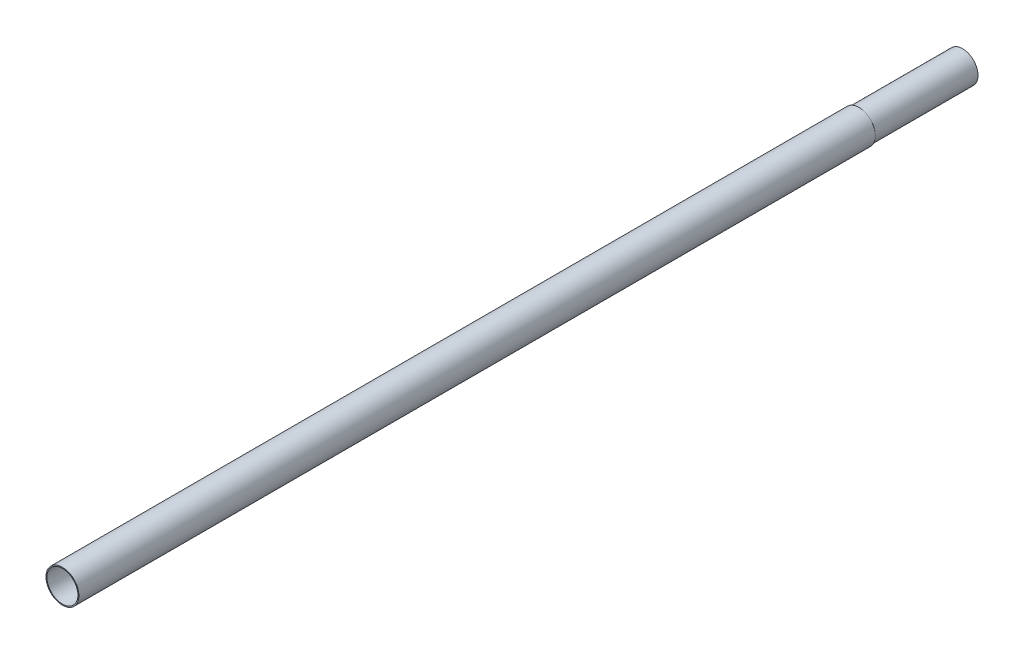
ISO-10303-21;
HEADER;
FILE_DESCRIPTION(('STEP AP214'),'2;1');
FILE_NAME('part.step','',(''),(''),'','','');
FILE_SCHEMA(('AUTOMOTIVE_DESIGN { 1 0 10303 214 1 1 1 1 }'));
ENDSEC;
DATA;
#1=APPLICATION_CONTEXT('core data for automotive mechanical design processes');
#2=APPLICATION_PROTOCOL_DEFINITION('international standard','automotive_design',2000,#1);
#3=PRODUCT_CONTEXT('',#1,'mechanical');
#4=PRODUCT('Part','Part','',(#3));
#5=PRODUCT_RELATED_PRODUCT_CATEGORY('part','',(#4));
#6=PRODUCT_DEFINITION_FORMATION('','',#4);
#7=PRODUCT_DEFINITION_CONTEXT('part definition',#1,'design');
#8=PRODUCT_DEFINITION('design','',#6,#7);
#9=PRODUCT_DEFINITION_SHAPE('','',#8);
#10=(LENGTH_UNIT() NAMED_UNIT(*) SI_UNIT(.MILLI.,.METRE.));
#11=(NAMED_UNIT(*) PLANE_ANGLE_UNIT() SI_UNIT($,.RADIAN.));
#12=(NAMED_UNIT(*) SI_UNIT($,.STERADIAN.) SOLID_ANGLE_UNIT());
#13=UNCERTAINTY_MEASURE_WITH_UNIT(LENGTH_MEASURE(1.E-05),#10,'distance_accuracy_value','');
#14=(GEOMETRIC_REPRESENTATION_CONTEXT(3) GLOBAL_UNCERTAINTY_ASSIGNED_CONTEXT((#13)) GLOBAL_UNIT_ASSIGNED_CONTEXT((#10,
#11,#12)) REPRESENTATION_CONTEXT('',''));
#15=CARTESIAN_POINT('',(0.,0.,0.));
#16=DIRECTION('',(0.,0.,1.));
#17=DIRECTION('',(1.,0.,0.));
#18=AXIS2_PLACEMENT_3D('',#15,#16,#17);
#19=CARTESIAN_POINT('',(0.,0.,67.5994082814339));
#20=DIRECTION('',(0.,0.,-1.));
#21=DIRECTION('',(-1.,0.,0.));
#22=AXIS2_PLACEMENT_3D('',#19,#20,#21);
#23=CYLINDRICAL_SURFACE('',#22,23.9);
#24=CARTESIAN_POINT('',(0.,0.,-160.));
#25=DIRECTION('',(0.,0.,-1.));
#26=DIRECTION('',(-1.,0.,0.));
#27=AXIS2_PLACEMENT_3D('',#24,#25,#26);
#28=CIRCLE('',#27,23.9);
#29=CARTESIAN_POINT('',(-23.9,0.,-160.));
#30=VERTEX_POINT('',#29);
#31=EDGE_CURVE('E53',#30,#30,#28,.T.);
#32=CARTESIAN_POINT('',(0.,0.,0.));
#33=DIRECTION('',(0.,0.,1.));
#34=DIRECTION('',(1.,0.,0.));
#35=AXIS2_PLACEMENT_3D('',#32,#33,#34);
#36=CIRCLE('',#35,23.9);
#37=CARTESIAN_POINT('',(-23.9,0.,0.));
#38=VERTEX_POINT('',#37);
#39=EDGE_CURVE('E49',#38,#38,#36,.F.);
#40=CARTESIAN_POINT('',(-23.9,0.,-160.));
#41=CARTESIAN_POINT('',(-23.9,0.,-158.333333333333));
#42=CARTESIAN_POINT('',(-23.9,0.,-156.666666666667));
#43=CARTESIAN_POINT('',(-23.9,0.,-153.333333333333));
#44=CARTESIAN_POINT('',(-23.9,0.,-151.666666666667));
#45=CARTESIAN_POINT('',(-23.9,0.,-148.333333333333));
#46=CARTESIAN_POINT('',(-23.9,0.,-146.666666666667));
#47=CARTESIAN_POINT('',(-23.9,0.,-143.333333333333));
#48=CARTESIAN_POINT('',(-23.9,0.,-141.666666666667));
#49=CARTESIAN_POINT('',(-23.9,0.,-138.333333333333));
#50=CARTESIAN_POINT('',(-23.9,0.,-136.666666666667));
#51=CARTESIAN_POINT('',(-23.9,0.,-133.333333333333));
#52=CARTESIAN_POINT('',(-23.9,0.,-131.666666666667));
#53=CARTESIAN_POINT('',(-23.9,0.,-128.333333333333));
#54=CARTESIAN_POINT('',(-23.9,0.,-126.666666666667));
#55=CARTESIAN_POINT('',(-23.9,0.,-123.333333333333));
#56=CARTESIAN_POINT('',(-23.9,0.,-121.666666666667));
#57=CARTESIAN_POINT('',(-23.9,0.,-118.333333333333));
#58=CARTESIAN_POINT('',(-23.9,0.,-116.666666666667));
#59=CARTESIAN_POINT('',(-23.9,0.,-113.333333333333));
#60=CARTESIAN_POINT('',(-23.9,0.,-111.666666666667));
#61=CARTESIAN_POINT('',(-23.9,0.,-108.333333333333));
#62=CARTESIAN_POINT('',(-23.9,0.,-106.666666666667));
#63=CARTESIAN_POINT('',(-23.9,0.,-103.333333333333));
#64=CARTESIAN_POINT('',(-23.9,0.,-101.666666666667));
#65=CARTESIAN_POINT('',(-23.9,0.,-98.3333333333333));
#66=CARTESIAN_POINT('',(-23.9,0.,-96.6666666666666));
#67=CARTESIAN_POINT('',(-23.9,0.,-93.3333333333333));
#68=CARTESIAN_POINT('',(-23.9,0.,-91.6666666666666));
#69=CARTESIAN_POINT('',(-23.9,0.,-88.3333333333333));
#70=CARTESIAN_POINT('',(-23.9,0.,-86.6666666666667));
#71=CARTESIAN_POINT('',(-23.9,0.,-83.3333333333333));
#72=CARTESIAN_POINT('',(-23.9,0.,-81.6666666666667));
#73=CARTESIAN_POINT('',(-23.9,0.,-78.3333333333333));
#74=CARTESIAN_POINT('',(-23.9,0.,-76.6666666666666));
#75=CARTESIAN_POINT('',(-23.9,0.,-73.3333333333333));
#76=CARTESIAN_POINT('',(-23.9,0.,-71.6666666666667));
#77=CARTESIAN_POINT('',(-23.9,0.,-68.3333333333333));
#78=CARTESIAN_POINT('',(-23.9,0.,-66.6666666666667));
#79=CARTESIAN_POINT('',(-23.9,0.,-63.3333333333333));
#80=CARTESIAN_POINT('',(-23.9,0.,-61.6666666666667));
#81=CARTESIAN_POINT('',(-23.9,0.,-58.3333333333333));
#82=CARTESIAN_POINT('',(-23.9,0.,-56.6666666666667));
#83=CARTESIAN_POINT('',(-23.9,0.,-53.3333333333333));
#84=CARTESIAN_POINT('',(-23.9,0.,-51.6666666666667));
#85=CARTESIAN_POINT('',(-23.9,0.,-48.3333333333333));
#86=CARTESIAN_POINT('',(-23.9,0.,-46.6666666666667));
#87=CARTESIAN_POINT('',(-23.9,0.,-43.3333333333333));
#88=CARTESIAN_POINT('',(-23.9,0.,-41.6666666666667));
#89=CARTESIAN_POINT('',(-23.9,0.,-38.3333333333333));
#90=CARTESIAN_POINT('',(-23.9,0.,-36.6666666666667));
#91=CARTESIAN_POINT('',(-23.9,0.,-33.3333333333333));
#92=CARTESIAN_POINT('',(-23.9,0.,-31.6666666666667));
#93=CARTESIAN_POINT('',(-23.9,0.,-28.3333333333333));
#94=CARTESIAN_POINT('',(-23.9,0.,-26.6666666666667));
#95=CARTESIAN_POINT('',(-23.9,0.,-23.3333333333333));
#96=CARTESIAN_POINT('',(-23.9,0.,-21.6666666666667));
#97=CARTESIAN_POINT('',(-23.9,0.,-18.3333333333333));
#98=CARTESIAN_POINT('',(-23.9,0.,-16.6666666666667));
#99=CARTESIAN_POINT('',(-23.9,0.,-13.3333333333333));
#100=CARTESIAN_POINT('',(-23.9,0.,-11.6666666666667));
#101=CARTESIAN_POINT('',(-23.9,0.,-8.33333333333335));
#102=CARTESIAN_POINT('',(-23.9,0.,-6.66666666666669));
#103=CARTESIAN_POINT('',(-23.9,0.,-3.33333333333335));
#104=CARTESIAN_POINT('',(-23.9,0.,-1.66666666666668));
#105=CARTESIAN_POINT('',(-23.9,0.,0.));
#106=B_SPLINE_CURVE_WITH_KNOTS('',3,(#40,#41,#42,#43,#44,#45,#46,#47,#48,#49,#50,#51,#52,#53,
#54,#55,#56,#57,#58,#59,#60,#61,#62,#63,#64,#65,#66,#67,#68,#69,#70,#71,#72,#73,#74,#75,#76,#77,
#78,#79,#80,#81,#82,#83,#84,#85,#86,#87,#88,#89,#90,#91,#92,#93,#94,#95,#96,#97,#98,#99,#100,
#101,#102,#103,#104,#105),.UNSPECIFIED.,.F.,.F.,(4,2,2,2,2,2,2,2,2,2,2,2,2,2,2,2,2,2,2,2,2,2,2,
2,2,2,2,2,2,2,2,2,4),(0.,5.,10.,15.,20.,25.,30.,35.,40.,45.,50.,55.,60.,65.,70.,75.,80.,85.,90.,
95.,100.,105.,110.,115.,120.,125.,130.,135.,140.,145.,150.,155.,160.),.UNSPECIFIED.);
#107=EDGE_CURVE('BSEAM45',#30,#38,#106,.T.);
#108=ORIENTED_EDGE('',*,*,#31,.F.);
#109=ORIENTED_EDGE('',*,*,#39,.T.);
#110=ORIENTED_EDGE('',*,*,#107,.T.);
#111=ORIENTED_EDGE('',*,*,#107,.F.);
#112=EDGE_LOOP('',(#108,#110,#109,#111));
#113=FACE_BOUND('',#112,.T.);
#114=ADVANCED_FACE('F45',(#113),#23,.T.);
#115=CARTESIAN_POINT('',(0.,0.,67.5994082814339));
#116=DIRECTION('',(0.,0.,-1.));
#117=DIRECTION('',(-1.,0.,0.));
#118=AXIS2_PLACEMENT_3D('',#115,#116,#117);
#119=CYLINDRICAL_SURFACE('',#118,22.4);
#120=CARTESIAN_POINT('',(0.,0.,-160.));
#121=DIRECTION('',(0.,0.,-1.));
#122=DIRECTION('',(-1.,0.,0.));
#123=AXIS2_PLACEMENT_3D('',#120,#121,#122);
#124=CIRCLE('',#123,22.4);
#125=CARTESIAN_POINT('',(-22.4,0.,-160.));
#126=VERTEX_POINT('',#125);
#127=EDGE_CURVE('E57',#126,#126,#124,.T.);
#128=CARTESIAN_POINT('',(0.,0.,0.));
#129=DIRECTION('',(0.,0.,1.));
#130=DIRECTION('',(1.,0.,0.));
#131=AXIS2_PLACEMENT_3D('',#128,#129,#130);
#132=CIRCLE('',#131,22.4);
#133=CARTESIAN_POINT('',(-22.4,0.,0.));
#134=VERTEX_POINT('',#133);
#135=EDGE_CURVE('E11',#134,#134,#132,.F.);
#136=CARTESIAN_POINT('',(-22.4,0.,-160.));
#137=CARTESIAN_POINT('',(-22.4,0.,-158.333333333333));
#138=CARTESIAN_POINT('',(-22.4,0.,-156.666666666667));
#139=CARTESIAN_POINT('',(-22.4,0.,-153.333333333333));
#140=CARTESIAN_POINT('',(-22.4,0.,-151.666666666667));
#141=CARTESIAN_POINT('',(-22.4,0.,-148.333333333333));
#142=CARTESIAN_POINT('',(-22.4,0.,-146.666666666667));
#143=CARTESIAN_POINT('',(-22.4,0.,-143.333333333333));
#144=CARTESIAN_POINT('',(-22.4,0.,-141.666666666667));
#145=CARTESIAN_POINT('',(-22.4,0.,-138.333333333333));
#146=CARTESIAN_POINT('',(-22.4,0.,-136.666666666667));
#147=CARTESIAN_POINT('',(-22.4,0.,-133.333333333333));
#148=CARTESIAN_POINT('',(-22.4,0.,-131.666666666667));
#149=CARTESIAN_POINT('',(-22.4,0.,-128.333333333333));
#150=CARTESIAN_POINT('',(-22.4,0.,-126.666666666667));
#151=CARTESIAN_POINT('',(-22.4,0.,-123.333333333333));
#152=CARTESIAN_POINT('',(-22.4,0.,-121.666666666667));
#153=CARTESIAN_POINT('',(-22.4,0.,-118.333333333333));
#154=CARTESIAN_POINT('',(-22.4,0.,-116.666666666667));
#155=CARTESIAN_POINT('',(-22.4,0.,-113.333333333333));
#156=CARTESIAN_POINT('',(-22.4,0.,-111.666666666667));
#157=CARTESIAN_POINT('',(-22.4,0.,-108.333333333333));
#158=CARTESIAN_POINT('',(-22.4,0.,-106.666666666667));
#159=CARTESIAN_POINT('',(-22.4,0.,-103.333333333333));
#160=CARTESIAN_POINT('',(-22.4,0.,-101.666666666667));
#161=CARTESIAN_POINT('',(-22.4,0.,-98.3333333333333));
#162=CARTESIAN_POINT('',(-22.4,0.,-96.6666666666666));
#163=CARTESIAN_POINT('',(-22.4,0.,-93.3333333333333));
#164=CARTESIAN_POINT('',(-22.4,0.,-91.6666666666666));
#165=CARTESIAN_POINT('',(-22.4,0.,-88.3333333333333));
#166=CARTESIAN_POINT('',(-22.4,0.,-86.6666666666667));
#167=CARTESIAN_POINT('',(-22.4,0.,-83.3333333333333));
#168=CARTESIAN_POINT('',(-22.4,0.,-81.6666666666667));
#169=CARTESIAN_POINT('',(-22.4,0.,-78.3333333333333));
#170=CARTESIAN_POINT('',(-22.4,0.,-76.6666666666666));
#171=CARTESIAN_POINT('',(-22.4,0.,-73.3333333333333));
#172=CARTESIAN_POINT('',(-22.4,0.,-71.6666666666667));
#173=CARTESIAN_POINT('',(-22.4,0.,-68.3333333333333));
#174=CARTESIAN_POINT('',(-22.4,0.,-66.6666666666667));
#175=CARTESIAN_POINT('',(-22.4,0.,-63.3333333333333));
#176=CARTESIAN_POINT('',(-22.4,0.,-61.6666666666667));
#177=CARTESIAN_POINT('',(-22.4,0.,-58.3333333333333));
#178=CARTESIAN_POINT('',(-22.4,0.,-56.6666666666667));
#179=CARTESIAN_POINT('',(-22.4,0.,-53.3333333333333));
#180=CARTESIAN_POINT('',(-22.4,0.,-51.6666666666667));
#181=CARTESIAN_POINT('',(-22.4,0.,-48.3333333333333));
#182=CARTESIAN_POINT('',(-22.4,0.,-46.6666666666667));
#183=CARTESIAN_POINT('',(-22.4,0.,-43.3333333333333));
#184=CARTESIAN_POINT('',(-22.4,0.,-41.6666666666667));
#185=CARTESIAN_POINT('',(-22.4,0.,-38.3333333333333));
#186=CARTESIAN_POINT('',(-22.4,0.,-36.6666666666667));
#187=CARTESIAN_POINT('',(-22.4,0.,-33.3333333333333));
#188=CARTESIAN_POINT('',(-22.4,0.,-31.6666666666667));
#189=CARTESIAN_POINT('',(-22.4,0.,-28.3333333333333));
#190=CARTESIAN_POINT('',(-22.4,0.,-26.6666666666667));
#191=CARTESIAN_POINT('',(-22.4,0.,-23.3333333333333));
#192=CARTESIAN_POINT('',(-22.4,0.,-21.6666666666667));
#193=CARTESIAN_POINT('',(-22.4,0.,-18.3333333333333));
#194=CARTESIAN_POINT('',(-22.4,0.,-16.6666666666667));
#195=CARTESIAN_POINT('',(-22.4,0.,-13.3333333333333));
#196=CARTESIAN_POINT('',(-22.4,0.,-11.6666666666667));
#197=CARTESIAN_POINT('',(-22.4,0.,-8.33333333333335));
#198=CARTESIAN_POINT('',(-22.4,0.,-6.66666666666669));
#199=CARTESIAN_POINT('',(-22.4,0.,-3.33333333333335));
#200=CARTESIAN_POINT('',(-22.4,0.,-1.66666666666668));
#201=CARTESIAN_POINT('',(-22.4,0.,0.));
#202=B_SPLINE_CURVE_WITH_KNOTS('',3,(#136,#137,#138,#139,#140,#141,#142,#143,#144,#145,#146,
#147,#148,#149,#150,#151,#152,#153,#154,#155,#156,#157,#158,#159,#160,#161,#162,#163,#164,#165,
#166,#167,#168,#169,#170,#171,#172,#173,#174,#175,#176,#177,#178,#179,#180,#181,#182,#183,#184,
#185,#186,#187,#188,#189,#190,#191,#192,#193,#194,#195,#196,#197,#198,#199,#200,#201),
.UNSPECIFIED.,.F.,.F.,(4,2,2,2,2,2,2,2,2,2,2,2,2,2,2,2,2,2,2,2,2,2,2,2,2,2,2,2,2,2,2,2,4),(0.,
5.,10.,15.,20.,25.,30.,35.,40.,45.,50.,55.,60.,65.,70.,75.,80.,85.,90.,95.,100.,105.,110.,115.,
120.,125.,130.,135.,140.,145.,150.,155.,160.),.UNSPECIFIED.);
#203=EDGE_CURVE('BSEAM72',#126,#134,#202,.T.);
#204=ORIENTED_EDGE('',*,*,#127,.T.);
#205=ORIENTED_EDGE('',*,*,#135,.F.);
#206=ORIENTED_EDGE('',*,*,#203,.T.);
#207=ORIENTED_EDGE('',*,*,#203,.F.);
#208=EDGE_LOOP('',(#204,#206,#205,#207));
#209=FACE_BOUND('',#208,.T.);
#210=ADVANCED_FACE('F72',(#209),#119,.F.);
#211=CARTESIAN_POINT('',(0.,0.,-160.));
#212=DIRECTION('',(0.,0.,-1.));
#213=DIRECTION('',(-1.,0.,0.));
#214=AXIS2_PLACEMENT_3D('',#211,#212,#213);
#215=PLANE('',#214);
#216=ORIENTED_EDGE('',*,*,#127,.F.);
#217=EDGE_LOOP('',(#216));
#218=FACE_BOUND('',#217,.T.);
#219=ORIENTED_EDGE('',*,*,#31,.T.);
#220=EDGE_LOOP('',(#219));
#221=FACE_BOUND('',#220,.T.);
#222=ADVANCED_FACE('F68',(#218,#221),#215,.T.);
#223=CARTESIAN_POINT('',(0.,0.,0.));
#224=DIRECTION('',(0.,0.,1.));
#225=DIRECTION('',(1.,0.,0.));
#226=AXIS2_PLACEMENT_3D('',#223,#224,#225);
#227=PLANE('',#226);
#228=ORIENTED_EDGE('',*,*,#39,.F.);
#229=EDGE_LOOP('',(#228));
#230=FACE_BOUND('',#229,.T.);
#231=ORIENTED_EDGE('',*,*,#135,.T.);
#232=EDGE_LOOP('',(#231));
#233=FACE_BOUND('',#232,.T.);
#234=ADVANCED_FACE('F47',(#230,#233),#227,.T.);
#235=CLOSED_SHELL('',(#114,#210,#222,#234));
#236=MANIFOLD_SOLID_BREP('B2',#235);
#237=CARTESIAN_POINT('',(0.,0.,1230.));
#238=DIRECTION('',(0.,0.,1.));
#239=DIRECTION('',(1.,0.,0.));
#240=AXIS2_PLACEMENT_3D('',#237,#238,#239);
#241=PLANE('',#240);
#242=CARTESIAN_POINT('',(0.,0.,1230.));
#243=DIRECTION('',(0.,0.,1.));
#244=DIRECTION('',(1.,0.,0.));
#245=AXIS2_PLACEMENT_3D('',#242,#243,#244);
#246=CIRCLE('',#245,25.4);
#247=CARTESIAN_POINT('',(25.4,0.,1230.));
#248=VERTEX_POINT('',#247);
#249=EDGE_CURVE('E44',#248,#248,#246,.T.);
#250=ORIENTED_EDGE('',*,*,#249,.T.);
#251=EDGE_LOOP('',(#250));
#252=FACE_BOUND('',#251,.T.);
#253=CARTESIAN_POINT('',(0.,0.,1230.));
#254=DIRECTION('',(0.,0.,1.));
#255=DIRECTION('',(1.,0.,0.));
#256=AXIS2_PLACEMENT_3D('',#253,#254,#255);
#257=CIRCLE('',#256,23.9);
#258=CARTESIAN_POINT('',(23.9,0.,1230.));
#259=VERTEX_POINT('',#258);
#260=EDGE_CURVE('E124',#259,#259,#257,.T.);
#261=ORIENTED_EDGE('',*,*,#260,.F.);
#262=EDGE_LOOP('',(#261));
#263=FACE_BOUND('',#262,.T.);
#264=ADVANCED_FACE('F113',(#252,#263),#241,.T.);
#265=CARTESIAN_POINT('',(0.,0.,0.));
#266=DIRECTION('',(0.,0.,1.));
#267=DIRECTION('',(1.,0.,0.));
#268=AXIS2_PLACEMENT_3D('',#265,#266,#267);
#269=PLANE('',#268);
#270=CARTESIAN_POINT('',(0.,0.,0.));
#271=DIRECTION('',(0.,0.,1.));
#272=DIRECTION('',(1.,0.,0.));
#273=AXIS2_PLACEMENT_3D('',#270,#271,#272);
#274=CIRCLE('',#273,25.4);
#275=CARTESIAN_POINT('',(25.4,0.,0.));
#276=VERTEX_POINT('',#275);
#277=EDGE_CURVE('E117',#276,#276,#274,.T.);
#278=ORIENTED_EDGE('',*,*,#277,.F.);
#279=EDGE_LOOP('',(#278));
#280=FACE_BOUND('',#279,.T.);
#281=CARTESIAN_POINT('',(0.,0.,0.));
#282=DIRECTION('',(0.,0.,1.));
#283=DIRECTION('',(1.,0.,0.));
#284=AXIS2_PLACEMENT_3D('',#281,#282,#283);
#285=CIRCLE('',#284,23.9);
#286=CARTESIAN_POINT('',(23.9,0.,0.));
#287=VERTEX_POINT('',#286);
#288=EDGE_CURVE('E126',#287,#287,#285,.T.);
#289=ORIENTED_EDGE('',*,*,#288,.T.);
#290=EDGE_LOOP('',(#289));
#291=FACE_BOUND('',#290,.T.);
#292=ADVANCED_FACE('F136',(#280,#291),#269,.F.);
#293=CARTESIAN_POINT('',(0.,0.,1230.));
#294=DIRECTION('',(0.,0.,-1.));
#295=DIRECTION('',(-1.,0.,0.));
#296=AXIS2_PLACEMENT_3D('',#293,#294,#295);
#297=CYLINDRICAL_SURFACE('',#296,25.4);
#298=ORIENTED_EDGE('',*,*,#249,.F.);
#299=EDGE_LOOP('',(#298));
#300=FACE_BOUND('',#299,.T.);
#301=ORIENTED_EDGE('',*,*,#277,.T.);
#302=EDGE_LOOP('',(#301));
#303=FACE_BOUND('',#302,.T.);
#304=ADVANCED_FACE('F115',(#300,#303),#297,.T.);
#305=CARTESIAN_POINT('',(0.,0.,1230.));
#306=DIRECTION('',(0.,0.,-1.));
#307=DIRECTION('',(-1.,0.,0.));
#308=AXIS2_PLACEMENT_3D('',#305,#306,#307);
#309=CYLINDRICAL_SURFACE('',#308,23.9);
#310=ORIENTED_EDGE('',*,*,#260,.T.);
#311=EDGE_LOOP('',(#310));
#312=FACE_BOUND('',#311,.T.);
#313=ORIENTED_EDGE('',*,*,#288,.F.);
#314=EDGE_LOOP('',(#313));
#315=FACE_BOUND('',#314,.T.);
#316=ADVANCED_FACE('F132',(#312,#315),#309,.F.);
#317=CLOSED_SHELL('',(#264,#292,#304,#316));
#318=MANIFOLD_SOLID_BREP('B6',#317);
#319=ADVANCED_BREP_SHAPE_REPRESENTATION('',(#18,#236,#318),#14);
#320=SHAPE_DEFINITION_REPRESENTATION(#9,#319);
ENDSEC;
END-ISO-10303-21;
